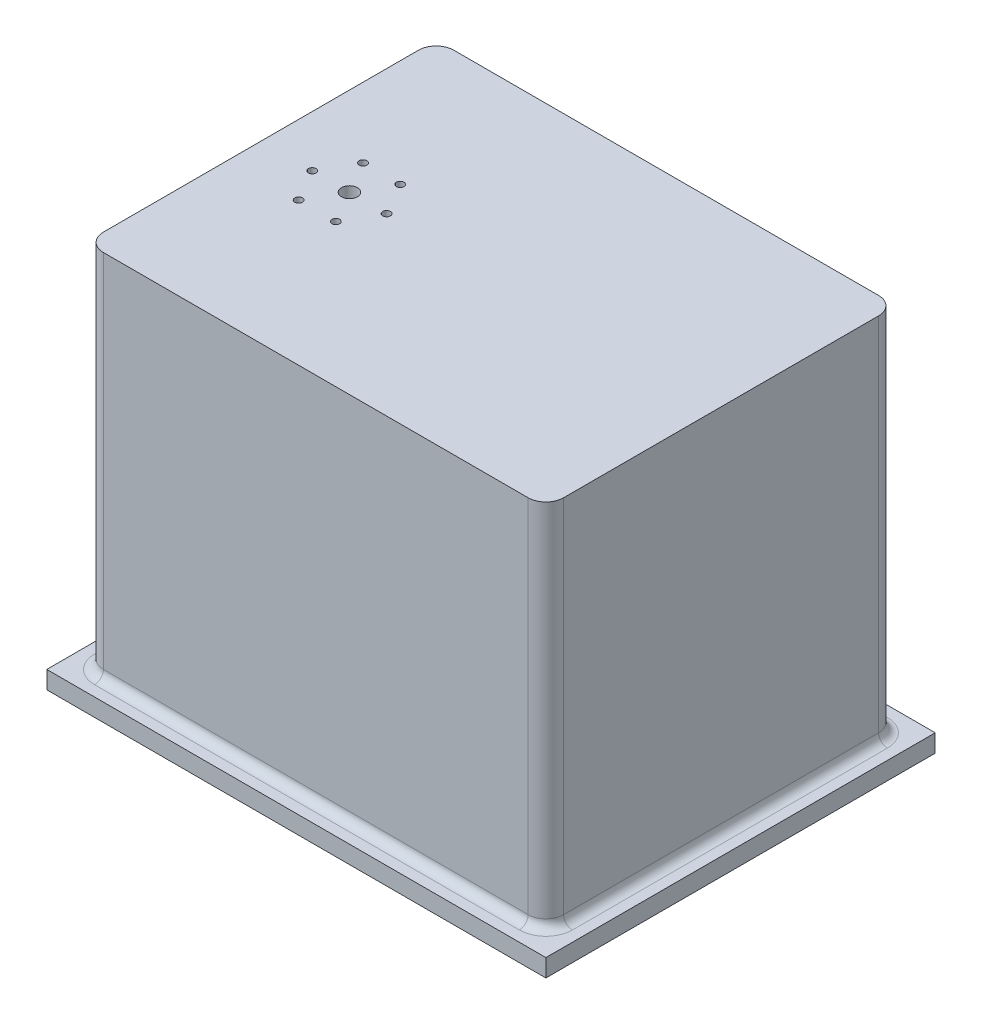
ISO-10303-21;
HEADER;
FILE_DESCRIPTION(('STEP AP214'),'2;1');
FILE_NAME('part.step','',(''),(''),'','','');
FILE_SCHEMA(('AUTOMOTIVE_DESIGN { 1 0 10303 214 1 1 1 1 }'));
ENDSEC;
DATA;
#1=APPLICATION_CONTEXT('core data for automotive mechanical design processes');
#2=APPLICATION_PROTOCOL_DEFINITION('international standard','automotive_design',2000,#1);
#3=PRODUCT_CONTEXT('',#1,'mechanical');
#4=PRODUCT('Part','Part','',(#3));
#5=PRODUCT_RELATED_PRODUCT_CATEGORY('part','',(#4));
#6=PRODUCT_DEFINITION_FORMATION('','',#4);
#7=PRODUCT_DEFINITION_CONTEXT('part definition',#1,'design');
#8=PRODUCT_DEFINITION('design','',#6,#7);
#9=PRODUCT_DEFINITION_SHAPE('','',#8);
#10=(LENGTH_UNIT() NAMED_UNIT(*) SI_UNIT(.MILLI.,.METRE.));
#11=(NAMED_UNIT(*) PLANE_ANGLE_UNIT() SI_UNIT($,.RADIAN.));
#12=(NAMED_UNIT(*) SI_UNIT($,.STERADIAN.) SOLID_ANGLE_UNIT());
#13=UNCERTAINTY_MEASURE_WITH_UNIT(LENGTH_MEASURE(1.E-05),#10,'distance_accuracy_value','');
#14=(GEOMETRIC_REPRESENTATION_CONTEXT(3) GLOBAL_UNCERTAINTY_ASSIGNED_CONTEXT((#13)) GLOBAL_UNIT_ASSIGNED_CONTEXT((#10,
#11,#12)) REPRESENTATION_CONTEXT('',''));
#15=CARTESIAN_POINT('',(0.,0.,0.));
#16=DIRECTION('',(0.,0.,1.));
#17=DIRECTION('',(1.,0.,0.));
#18=AXIS2_PLACEMENT_3D('',#15,#16,#17);
#19=CARTESIAN_POINT('',(0.,0.,0.));
#20=DIRECTION('',(0.,1.,0.));
#21=DIRECTION('',(0.,0.,1.));
#22=AXIS2_PLACEMENT_3D('',#19,#20,#21);
#23=PLANE('',#22);
#24=DIRECTION('',(-1.,0.,0.));
#25=VECTOR('',#24,1.);
#26=CARTESIAN_POINT('',(120.,0.,-89.));
#27=LINE('',#26,#25);
#28=CARTESIAN_POINT('',(120.,0.,-89.));
#29=VERTEX_POINT('',#28);
#30=CARTESIAN_POINT('',(-120.,0.,-89.));
#31=VERTEX_POINT('',#30);
#32=EDGE_CURVE('E208',#29,#31,#27,.T.);
#33=ORIENTED_EDGE('',*,*,#32,.T.);
#34=DIRECTION('',(0.,0.,1.));
#35=VECTOR('',#34,1.);
#36=CARTESIAN_POINT('',(-120.,0.,-89.));
#37=LINE('',#36,#35);
#38=CARTESIAN_POINT('',(-120.,0.,89.));
#39=VERTEX_POINT('',#38);
#40=EDGE_CURVE('E213',#31,#39,#37,.T.);
#41=ORIENTED_EDGE('',*,*,#40,.T.);
#42=DIRECTION('',(1.,0.,0.));
#43=VECTOR('',#42,1.);
#44=CARTESIAN_POINT('',(-120.,0.,89.));
#45=LINE('',#44,#43);
#46=CARTESIAN_POINT('',(120.,0.,89.));
#47=VERTEX_POINT('',#46);
#48=EDGE_CURVE('E237',#39,#47,#45,.T.);
#49=ORIENTED_EDGE('',*,*,#48,.T.);
#50=DIRECTION('',(0.,0.,-1.));
#51=VECTOR('',#50,1.);
#52=CARTESIAN_POINT('',(120.,0.,89.));
#53=LINE('',#52,#51);
#54=EDGE_CURVE('E224',#47,#29,#53,.T.);
#55=ORIENTED_EDGE('',*,*,#54,.T.);
#56=EDGE_LOOP('',(#33,#41,#49,#55));
#57=FACE_BOUND('',#56,.T.);
#58=DIRECTION('',(0.,0.,-1.));
#59=VECTOR('',#58,1.);
#60=CARTESIAN_POINT('',(141.,0.,110.));
#61=LINE('',#60,#59);
#62=CARTESIAN_POINT('',(141.,0.,110.));
#63=VERTEX_POINT('',#62);
#64=CARTESIAN_POINT('',(141.,0.,-110.));
#65=VERTEX_POINT('',#64);
#66=EDGE_CURVE('E206',#63,#65,#61,.T.);
#67=ORIENTED_EDGE('',*,*,#66,.F.);
#68=DIRECTION('',(1.,0.,0.));
#69=VECTOR('',#68,1.);
#70=CARTESIAN_POINT('',(-141.,0.,110.));
#71=LINE('',#70,#69);
#72=CARTESIAN_POINT('',(-141.,0.,110.));
#73=VERTEX_POINT('',#72);
#74=EDGE_CURVE('E202',#73,#63,#71,.T.);
#75=ORIENTED_EDGE('',*,*,#74,.F.);
#76=DIRECTION('',(0.,0.,1.));
#77=VECTOR('',#76,1.);
#78=CARTESIAN_POINT('',(-141.,0.,-110.));
#79=LINE('',#78,#77);
#80=CARTESIAN_POINT('',(-141.,0.,-110.));
#81=VERTEX_POINT('',#80);
#82=EDGE_CURVE('E396',#81,#73,#79,.T.);
#83=ORIENTED_EDGE('',*,*,#82,.F.);
#84=DIRECTION('',(-1.,0.,0.));
#85=VECTOR('',#84,1.);
#86=CARTESIAN_POINT('',(141.,0.,-110.));
#87=LINE('',#86,#85);
#88=EDGE_CURVE('E393',#65,#81,#87,.T.);
#89=ORIENTED_EDGE('',*,*,#88,.F.);
#90=EDGE_LOOP('',(#67,#75,#83,#89));
#91=FACE_BOUND('',#90,.T.);
#92=ADVANCED_FACE('F41',(#57,#91),#23,.F.);
#93=CARTESIAN_POINT('',(120.,209.,-89.));
#94=DIRECTION('',(0.,0.,1.));
#95=DIRECTION('',(1.,0.,0.));
#96=AXIS2_PLACEMENT_3D('',#93,#94,#95);
#97=PLANE('',#96);
#98=ORIENTED_EDGE('',*,*,#32,.F.);
#99=DIRECTION('',(0.,-1.,0.));
#100=VECTOR('',#99,1.);
#101=CARTESIAN_POINT('',(120.,209.,-89.));
#102=LINE('',#101,#100);
#103=CARTESIAN_POINT('',(120.,209.,-89.));
#104=VERTEX_POINT('',#103);
#105=EDGE_CURVE('E232',#104,#29,#102,.T.);
#106=ORIENTED_EDGE('',*,*,#105,.F.);
#107=DIRECTION('',(-1.,0.,0.));
#108=VECTOR('',#107,1.);
#109=CARTESIAN_POINT('',(120.,209.,-89.));
#110=LINE('',#109,#108);
#111=CARTESIAN_POINT('',(-120.,209.,-89.));
#112=VERTEX_POINT('',#111);
#113=EDGE_CURVE('E219',#104,#112,#110,.T.);
#114=ORIENTED_EDGE('',*,*,#113,.T.);
#115=DIRECTION('',(0.,-1.,0.));
#116=VECTOR('',#115,1.);
#117=CARTESIAN_POINT('',(-120.,209.,-89.));
#118=LINE('',#117,#116);
#119=EDGE_CURVE('E253',#112,#31,#118,.T.);
#120=ORIENTED_EDGE('',*,*,#119,.T.);
#121=EDGE_LOOP('',(#98,#106,#114,#120));
#122=FACE_BOUND('',#121,.T.);
#123=ADVANCED_FACE('F562',(#122),#97,.T.);
#124=CARTESIAN_POINT('',(-120.,209.,-89.));
#125=DIRECTION('',(1.,0.,0.));
#126=DIRECTION('',(0.,0.,-1.));
#127=AXIS2_PLACEMENT_3D('',#124,#125,#126);
#128=PLANE('',#127);
#129=ORIENTED_EDGE('',*,*,#40,.F.);
#130=ORIENTED_EDGE('',*,*,#119,.F.);
#131=DIRECTION('',(0.,0.,1.));
#132=VECTOR('',#131,1.);
#133=CARTESIAN_POINT('',(-120.,209.,-89.));
#134=LINE('',#133,#132);
#135=CARTESIAN_POINT('',(-120.,209.,89.));
#136=VERTEX_POINT('',#135);
#137=EDGE_CURVE('E223',#112,#136,#134,.T.);
#138=ORIENTED_EDGE('',*,*,#137,.T.);
#139=DIRECTION('',(0.,-1.,0.));
#140=VECTOR('',#139,1.);
#141=CARTESIAN_POINT('',(-120.,209.,89.));
#142=LINE('',#141,#140);
#143=EDGE_CURVE('E250',#136,#39,#142,.T.);
#144=ORIENTED_EDGE('',*,*,#143,.T.);
#145=EDGE_LOOP('',(#129,#130,#138,#144));
#146=FACE_BOUND('',#145,.T.);
#147=ADVANCED_FACE('F568',(#146),#128,.T.);
#148=CARTESIAN_POINT('',(-120.,209.,89.));
#149=DIRECTION('',(0.,0.,-1.));
#150=DIRECTION('',(-1.,0.,0.));
#151=AXIS2_PLACEMENT_3D('',#148,#149,#150);
#152=PLANE('',#151);
#153=ORIENTED_EDGE('',*,*,#48,.F.);
#154=ORIENTED_EDGE('',*,*,#143,.F.);
#155=DIRECTION('',(1.,0.,0.));
#156=VECTOR('',#155,1.);
#157=CARTESIAN_POINT('',(-120.,209.,89.));
#158=LINE('',#157,#156);
#159=CARTESIAN_POINT('',(120.,209.,89.));
#160=VERTEX_POINT('',#159);
#161=EDGE_CURVE('E227',#136,#160,#158,.T.);
#162=ORIENTED_EDGE('',*,*,#161,.T.);
#163=DIRECTION('',(0.,-1.,0.));
#164=VECTOR('',#163,1.);
#165=CARTESIAN_POINT('',(120.,209.,89.));
#166=LINE('',#165,#164);
#167=EDGE_CURVE('E247',#160,#47,#166,.T.);
#168=ORIENTED_EDGE('',*,*,#167,.T.);
#169=EDGE_LOOP('',(#153,#154,#162,#168));
#170=FACE_BOUND('',#169,.T.);
#171=ADVANCED_FACE('F622',(#170),#152,.T.);
#172=CARTESIAN_POINT('',(120.,209.,89.));
#173=DIRECTION('',(-1.,0.,0.));
#174=DIRECTION('',(0.,0.,1.));
#175=AXIS2_PLACEMENT_3D('',#172,#173,#174);
#176=PLANE('',#175);
#177=ORIENTED_EDGE('',*,*,#54,.F.);
#178=ORIENTED_EDGE('',*,*,#167,.F.);
#179=DIRECTION('',(0.,0.,-1.));
#180=VECTOR('',#179,1.);
#181=CARTESIAN_POINT('',(120.,209.,89.));
#182=LINE('',#181,#180);
#183=EDGE_CURVE('E230',#160,#104,#182,.T.);
#184=ORIENTED_EDGE('',*,*,#183,.T.);
#185=ORIENTED_EDGE('',*,*,#105,.T.);
#186=EDGE_LOOP('',(#177,#178,#184,#185));
#187=FACE_BOUND('',#186,.T.);
#188=ADVANCED_FACE('F618',(#187),#176,.T.);
#189=CARTESIAN_POINT('',(0.,209.,0.));
#190=DIRECTION('',(0.,1.,0.));
#191=DIRECTION('',(0.,0.,1.));
#192=AXIS2_PLACEMENT_3D('',#189,#190,#191);
#193=PLANE('',#192);
#194=CARTESIAN_POINT('',(-59.,209.,0.));
#195=DIRECTION('',(0.,1.,0.));
#196=DIRECTION('',(0.,0.,1.));
#197=AXIS2_PLACEMENT_3D('',#194,#195,#196);
#198=CIRCLE('',#197,2.17);
#199=CARTESIAN_POINT('',(-59.,209.,2.17));
#200=VERTEX_POINT('',#199);
#201=EDGE_CURVE('E361',#200,#200,#198,.T.);
#202=ORIENTED_EDGE('',*,*,#201,.T.);
#203=EDGE_LOOP('',(#202));
#204=FACE_BOUND('',#203,.T.);
#205=CARTESIAN_POINT('',(-80.,209.,0.));
#206=DIRECTION('',(0.,1.,0.));
#207=DIRECTION('',(0.,0.,1.));
#208=AXIS2_PLACEMENT_3D('',#205,#206,#207);
#209=CIRCLE('',#208,4.5);
#210=CARTESIAN_POINT('',(-80.,209.,4.5));
#211=VERTEX_POINT('',#210);
#212=EDGE_CURVE('E423',#211,#211,#209,.T.);
#213=ORIENTED_EDGE('',*,*,#212,.T.);
#214=EDGE_LOOP('',(#213));
#215=FACE_BOUND('',#214,.T.);
#216=CARTESIAN_POINT('',(-69.5,209.,18.1865334794732));
#217=DIRECTION('',(0.,1.,0.));
#218=DIRECTION('',(0.,0.,1.));
#219=AXIS2_PLACEMENT_3D('',#216,#217,#218);
#220=CIRCLE('',#219,2.17);
#221=CARTESIAN_POINT('',(-69.5,209.,20.3565334794732));
#222=VERTEX_POINT('',#221);
#223=EDGE_CURVE('E427',#222,#222,#220,.T.);
#224=ORIENTED_EDGE('',*,*,#223,.T.);
#225=EDGE_LOOP('',(#224));
#226=FACE_BOUND('',#225,.T.);
#227=CARTESIAN_POINT('',(-90.5000000000001,209.,18.1865334794732));
#228=DIRECTION('',(0.,1.,0.));
#229=DIRECTION('',(0.,0.,1.));
#230=AXIS2_PLACEMENT_3D('',#227,#228,#229);
#231=CIRCLE('',#230,2.17);
#232=CARTESIAN_POINT('',(-90.5000000000001,209.,20.3565334794732));
#233=VERTEX_POINT('',#232);
#234=EDGE_CURVE('E431',#233,#233,#231,.T.);
#235=ORIENTED_EDGE('',*,*,#234,.T.);
#236=EDGE_LOOP('',(#235));
#237=FACE_BOUND('',#236,.T.);
#238=CARTESIAN_POINT('',(-101.,209.,-1.51785732787831E-13));
#239=DIRECTION('',(0.,1.,0.));
#240=DIRECTION('',(0.,0.,1.));
#241=AXIS2_PLACEMENT_3D('',#238,#239,#240);
#242=CIRCLE('',#241,2.17);
#243=CARTESIAN_POINT('',(-101.,209.,2.16999999999985));
#244=VERTEX_POINT('',#243);
#245=EDGE_CURVE('E435',#244,#244,#242,.T.);
#246=ORIENTED_EDGE('',*,*,#245,.T.);
#247=EDGE_LOOP('',(#246));
#248=FACE_BOUND('',#247,.T.);
#249=CARTESIAN_POINT('',(-90.4999999999998,209.,-18.1865334794733));
#250=DIRECTION('',(0.,1.,0.));
#251=DIRECTION('',(0.,0.,1.));
#252=AXIS2_PLACEMENT_3D('',#249,#250,#251);
#253=CIRCLE('',#252,2.17);
#254=CARTESIAN_POINT('',(-90.4999999999998,209.,-16.0165334794733));
#255=VERTEX_POINT('',#254);
#256=EDGE_CURVE('E439',#255,#255,#253,.T.);
#257=ORIENTED_EDGE('',*,*,#256,.T.);
#258=EDGE_LOOP('',(#257));
#259=FACE_BOUND('',#258,.T.);
#260=CARTESIAN_POINT('',(-69.4999999999998,209.,-18.1865334794731));
#261=DIRECTION('',(0.,1.,0.));
#262=DIRECTION('',(0.,0.,1.));
#263=AXIS2_PLACEMENT_3D('',#260,#261,#262);
#264=CIRCLE('',#263,2.17);
#265=CARTESIAN_POINT('',(-69.4999999999998,209.,-16.0165334794731));
#266=VERTEX_POINT('',#265);
#267=EDGE_CURVE('E443',#266,#266,#264,.T.);
#268=ORIENTED_EDGE('',*,*,#267,.T.);
#269=EDGE_LOOP('',(#268));
#270=FACE_BOUND('',#269,.T.);
#271=ORIENTED_EDGE('',*,*,#113,.F.);
#272=ORIENTED_EDGE('',*,*,#183,.F.);
#273=ORIENTED_EDGE('',*,*,#161,.F.);
#274=ORIENTED_EDGE('',*,*,#137,.F.);
#275=EDGE_LOOP('',(#271,#272,#273,#274));
#276=FACE_BOUND('',#275,.T.);
#277=ADVANCED_FACE('F607',(#204,#215,#226,#237,#248,#259,#270,#276),#193,.F.);
#278=CARTESIAN_POINT('',(0.,9.99999999999997,0.));
#279=DIRECTION('',(0.,1.,0.));
#280=DIRECTION('',(0.,0.,1.));
#281=AXIS2_PLACEMENT_3D('',#278,#279,#280);
#282=PLANE('',#281);
#283=DIRECTION('',(1.,0.,0.));
#284=VECTOR('',#283,1.);
#285=CARTESIAN_POINT('',(0.,9.99999999999997,104.));
#286=LINE('',#285,#284);
#287=CARTESIAN_POINT('',(120.,9.99999999999997,104.));
#288=VERTEX_POINT('',#287);
#289=CARTESIAN_POINT('',(-120.,9.99999999999997,104.));
#290=VERTEX_POINT('',#289);
#291=EDGE_CURVE('E311',#288,#290,#286,.F.);
#292=ORIENTED_EDGE('',*,*,#291,.T.);
#293=CARTESIAN_POINT('',(-120.,9.99999999999997,89.));
#294=DIRECTION('',(0.,1.,0.));
#295=DIRECTION('',(0.,0.,1.));
#296=AXIS2_PLACEMENT_3D('',#293,#294,#295);
#297=CIRCLE('',#296,15.);
#298=CARTESIAN_POINT('',(-135.,9.99999999999997,89.));
#299=VERTEX_POINT('',#298);
#300=EDGE_CURVE('E332',#290,#299,#297,.F.);
#301=ORIENTED_EDGE('',*,*,#300,.T.);
#302=DIRECTION('',(0.,0.,1.));
#303=VECTOR('',#302,1.);
#304=CARTESIAN_POINT('',(-135.,9.99999999999997,0.));
#305=LINE('',#304,#303);
#306=CARTESIAN_POINT('',(-135.,9.99999999999997,-89.));
#307=VERTEX_POINT('',#306);
#308=EDGE_CURVE('E329',#299,#307,#305,.F.);
#309=ORIENTED_EDGE('',*,*,#308,.T.);
#310=CARTESIAN_POINT('',(-120.,9.99999999999997,-89.));
#311=DIRECTION('',(0.,1.,0.));
#312=DIRECTION('',(0.,0.,1.));
#313=AXIS2_PLACEMENT_3D('',#310,#311,#312);
#314=CIRCLE('',#313,15.);
#315=CARTESIAN_POINT('',(-120.,9.99999999999997,-104.));
#316=VERTEX_POINT('',#315);
#317=EDGE_CURVE('E326',#307,#316,#314,.F.);
#318=ORIENTED_EDGE('',*,*,#317,.T.);
#319=DIRECTION('',(-1.,0.,0.));
#320=VECTOR('',#319,1.);
#321=CARTESIAN_POINT('',(0.,9.99999999999997,-104.));
#322=LINE('',#321,#320);
#323=CARTESIAN_POINT('',(120.,9.99999999999997,-104.));
#324=VERTEX_POINT('',#323);
#325=EDGE_CURVE('E323',#316,#324,#322,.F.);
#326=ORIENTED_EDGE('',*,*,#325,.T.);
#327=CARTESIAN_POINT('',(120.,9.99999999999997,-89.));
#328=DIRECTION('',(0.,1.,0.));
#329=DIRECTION('',(0.,0.,1.));
#330=AXIS2_PLACEMENT_3D('',#327,#328,#329);
#331=CIRCLE('',#330,15.);
#332=CARTESIAN_POINT('',(135.,9.99999999999997,-89.));
#333=VERTEX_POINT('',#332);
#334=EDGE_CURVE('E320',#324,#333,#331,.F.);
#335=ORIENTED_EDGE('',*,*,#334,.T.);
#336=DIRECTION('',(0.,0.,-1.));
#337=VECTOR('',#336,1.);
#338=CARTESIAN_POINT('',(135.,9.99999999999997,0.));
#339=LINE('',#338,#337);
#340=CARTESIAN_POINT('',(135.,9.99999999999997,89.));
#341=VERTEX_POINT('',#340);
#342=EDGE_CURVE('E317',#333,#341,#339,.F.);
#343=ORIENTED_EDGE('',*,*,#342,.T.);
#344=CARTESIAN_POINT('',(120.,9.99999999999997,89.));
#345=DIRECTION('',(0.,1.,0.));
#346=DIRECTION('',(0.,0.,1.));
#347=AXIS2_PLACEMENT_3D('',#344,#345,#346);
#348=CIRCLE('',#347,15.);
#349=EDGE_CURVE('E314',#341,#288,#348,.F.);
#350=ORIENTED_EDGE('',*,*,#349,.T.);
#351=EDGE_LOOP('',(#292,#301,#309,#318,#326,#335,#343,#350));
#352=FACE_BOUND('',#351,.T.);
#353=DIRECTION('',(0.,0.,-1.));
#354=VECTOR('',#353,1.);
#355=CARTESIAN_POINT('',(141.,9.99999999999997,110.));
#356=LINE('',#355,#354);
#357=CARTESIAN_POINT('',(141.,9.99999999999997,110.));
#358=VERTEX_POINT('',#357);
#359=CARTESIAN_POINT('',(141.,9.99999999999997,-110.));
#360=VERTEX_POINT('',#359);
#361=EDGE_CURVE('E192',#358,#360,#356,.T.);
#362=ORIENTED_EDGE('',*,*,#361,.T.);
#363=DIRECTION('',(-1.,0.,0.));
#364=VECTOR('',#363,1.);
#365=CARTESIAN_POINT('',(141.,9.99999999999997,-110.));
#366=LINE('',#365,#364);
#367=CARTESIAN_POINT('',(-141.,9.99999999999997,-110.));
#368=VERTEX_POINT('',#367);
#369=EDGE_CURVE('E180',#360,#368,#366,.T.);
#370=ORIENTED_EDGE('',*,*,#369,.T.);
#371=DIRECTION('',(0.,0.,1.));
#372=VECTOR('',#371,1.);
#373=CARTESIAN_POINT('',(-141.,9.99999999999997,-110.));
#374=LINE('',#373,#372);
#375=CARTESIAN_POINT('',(-141.,9.99999999999997,110.));
#376=VERTEX_POINT('',#375);
#377=EDGE_CURVE('E191',#368,#376,#374,.T.);
#378=ORIENTED_EDGE('',*,*,#377,.T.);
#379=DIRECTION('',(1.,0.,0.));
#380=VECTOR('',#379,1.);
#381=CARTESIAN_POINT('',(-141.,9.99999999999997,110.));
#382=LINE('',#381,#380);
#383=EDGE_CURVE('E197',#376,#358,#382,.T.);
#384=ORIENTED_EDGE('',*,*,#383,.T.);
#385=EDGE_LOOP('',(#362,#370,#378,#384));
#386=FACE_BOUND('',#385,.T.);
#387=ADVANCED_FACE('F195',(#352,#386),#282,.T.);
#388=CARTESIAN_POINT('',(141.,9.99999999999997,110.));
#389=DIRECTION('',(-1.,0.,0.));
#390=DIRECTION('',(0.,0.,1.));
#391=AXIS2_PLACEMENT_3D('',#388,#389,#390);
#392=PLANE('',#391);
#393=ORIENTED_EDGE('',*,*,#66,.T.);
#394=DIRECTION('',(0.,-1.,0.));
#395=VECTOR('',#394,1.);
#396=CARTESIAN_POINT('',(141.,9.99999999999997,-110.));
#397=LINE('',#396,#395);
#398=EDGE_CURVE('E184',#360,#65,#397,.T.);
#399=ORIENTED_EDGE('',*,*,#398,.F.);
#400=ORIENTED_EDGE('',*,*,#361,.F.);
#401=DIRECTION('',(0.,-1.,0.));
#402=VECTOR('',#401,1.);
#403=CARTESIAN_POINT('',(141.,9.99999999999997,110.));
#404=LINE('',#403,#402);
#405=EDGE_CURVE('E405',#358,#63,#404,.T.);
#406=ORIENTED_EDGE('',*,*,#405,.T.);
#407=EDGE_LOOP('',(#393,#399,#400,#406));
#408=FACE_BOUND('',#407,.T.);
#409=ADVANCED_FACE('F204',(#408),#392,.F.);
#410=CARTESIAN_POINT('',(141.,9.99999999999997,-110.));
#411=DIRECTION('',(0.,0.,1.));
#412=DIRECTION('',(1.,0.,0.));
#413=AXIS2_PLACEMENT_3D('',#410,#411,#412);
#414=PLANE('',#413);
#415=ORIENTED_EDGE('',*,*,#88,.T.);
#416=DIRECTION('',(0.,-1.,0.));
#417=VECTOR('',#416,1.);
#418=CARTESIAN_POINT('',(-141.,9.99999999999997,-110.));
#419=LINE('',#418,#417);
#420=EDGE_CURVE('E187',#368,#81,#419,.T.);
#421=ORIENTED_EDGE('',*,*,#420,.F.);
#422=ORIENTED_EDGE('',*,*,#369,.F.);
#423=ORIENTED_EDGE('',*,*,#398,.T.);
#424=EDGE_LOOP('',(#415,#421,#422,#423));
#425=FACE_BOUND('',#424,.T.);
#426=ADVANCED_FACE('F182',(#425),#414,.F.);
#427=CARTESIAN_POINT('',(-141.,9.99999999999997,-110.));
#428=DIRECTION('',(1.,0.,0.));
#429=DIRECTION('',(0.,0.,-1.));
#430=AXIS2_PLACEMENT_3D('',#427,#428,#429);
#431=PLANE('',#430);
#432=ORIENTED_EDGE('',*,*,#82,.T.);
#433=DIRECTION('',(0.,-1.,0.));
#434=VECTOR('',#433,1.);
#435=CARTESIAN_POINT('',(-141.,9.99999999999997,110.));
#436=LINE('',#435,#434);
#437=EDGE_CURVE('E215',#376,#73,#436,.T.);
#438=ORIENTED_EDGE('',*,*,#437,.F.);
#439=ORIENTED_EDGE('',*,*,#377,.F.);
#440=ORIENTED_EDGE('',*,*,#420,.T.);
#441=EDGE_LOOP('',(#432,#438,#439,#440));
#442=FACE_BOUND('',#441,.T.);
#443=ADVANCED_FACE('F416',(#442),#431,.F.);
#444=CARTESIAN_POINT('',(-141.,9.99999999999997,110.));
#445=DIRECTION('',(0.,0.,-1.));
#446=DIRECTION('',(-1.,0.,0.));
#447=AXIS2_PLACEMENT_3D('',#444,#445,#446);
#448=PLANE('',#447);
#449=ORIENTED_EDGE('',*,*,#74,.T.);
#450=ORIENTED_EDGE('',*,*,#405,.F.);
#451=ORIENTED_EDGE('',*,*,#383,.F.);
#452=ORIENTED_EDGE('',*,*,#437,.T.);
#453=EDGE_LOOP('',(#449,#450,#451,#452));
#454=FACE_BOUND('',#453,.T.);
#455=ADVANCED_FACE('F412',(#454),#448,.F.);
#456=CARTESIAN_POINT('',(0.,219.,0.));
#457=DIRECTION('',(0.,1.,0.));
#458=DIRECTION('',(0.,0.,1.));
#459=AXIS2_PLACEMENT_3D('',#456,#457,#458);
#460=PLANE('',#459);
#461=CARTESIAN_POINT('',(-59.,219.,0.));
#462=DIRECTION('',(0.,1.,0.));
#463=DIRECTION('',(0.,0.,1.));
#464=AXIS2_PLACEMENT_3D('',#461,#462,#463);
#465=CIRCLE('',#464,2.17);
#466=CARTESIAN_POINT('',(-59.,219.,2.17));
#467=VERTEX_POINT('',#466);
#468=EDGE_CURVE('E447',#467,#467,#465,.T.);
#469=ORIENTED_EDGE('',*,*,#468,.F.);
#470=EDGE_LOOP('',(#469));
#471=FACE_BOUND('',#470,.T.);
#472=CARTESIAN_POINT('',(-80.,219.,0.));
#473=DIRECTION('',(0.,1.,0.));
#474=DIRECTION('',(0.,0.,1.));
#475=AXIS2_PLACEMENT_3D('',#472,#473,#474);
#476=CIRCLE('',#475,4.5);
#477=CARTESIAN_POINT('',(-80.,219.,4.5));
#478=VERTEX_POINT('',#477);
#479=EDGE_CURVE('E468',#478,#478,#476,.T.);
#480=ORIENTED_EDGE('',*,*,#479,.F.);
#481=EDGE_LOOP('',(#480));
#482=FACE_BOUND('',#481,.T.);
#483=CARTESIAN_POINT('',(-69.5,219.,18.1865334794732));
#484=DIRECTION('',(0.,1.,0.));
#485=DIRECTION('',(0.,0.,1.));
#486=AXIS2_PLACEMENT_3D('',#483,#484,#485);
#487=CIRCLE('',#486,2.17);
#488=CARTESIAN_POINT('',(-69.5,219.,20.3565334794732));
#489=VERTEX_POINT('',#488);
#490=EDGE_CURVE('E464',#489,#489,#487,.T.);
#491=ORIENTED_EDGE('',*,*,#490,.F.);
#492=EDGE_LOOP('',(#491));
#493=FACE_BOUND('',#492,.T.);
#494=CARTESIAN_POINT('',(-90.5000000000001,219.,18.1865334794732));
#495=DIRECTION('',(0.,1.,0.));
#496=DIRECTION('',(0.,0.,1.));
#497=AXIS2_PLACEMENT_3D('',#494,#495,#496);
#498=CIRCLE('',#497,2.17);
#499=CARTESIAN_POINT('',(-90.5000000000001,219.,20.3565334794732));
#500=VERTEX_POINT('',#499);
#501=EDGE_CURVE('E460',#500,#500,#498,.T.);
#502=ORIENTED_EDGE('',*,*,#501,.F.);
#503=EDGE_LOOP('',(#502));
#504=FACE_BOUND('',#503,.T.);
#505=CARTESIAN_POINT('',(-101.,219.,-1.51785732787831E-13));
#506=DIRECTION('',(0.,1.,0.));
#507=DIRECTION('',(0.,0.,1.));
#508=AXIS2_PLACEMENT_3D('',#505,#506,#507);
#509=CIRCLE('',#508,2.17);
#510=CARTESIAN_POINT('',(-101.,219.,2.16999999999985));
#511=VERTEX_POINT('',#510);
#512=EDGE_CURVE('E456',#511,#511,#509,.T.);
#513=ORIENTED_EDGE('',*,*,#512,.F.);
#514=EDGE_LOOP('',(#513));
#515=FACE_BOUND('',#514,.T.);
#516=CARTESIAN_POINT('',(-90.4999999999998,219.,-18.1865334794733));
#517=DIRECTION('',(0.,1.,0.));
#518=DIRECTION('',(0.,0.,1.));
#519=AXIS2_PLACEMENT_3D('',#516,#517,#518);
#520=CIRCLE('',#519,2.17);
#521=CARTESIAN_POINT('',(-90.4999999999998,219.,-16.0165334794733));
#522=VERTEX_POINT('',#521);
#523=EDGE_CURVE('E452',#522,#522,#520,.T.);
#524=ORIENTED_EDGE('',*,*,#523,.F.);
#525=EDGE_LOOP('',(#524));
#526=FACE_BOUND('',#525,.T.);
#527=CARTESIAN_POINT('',(-69.4999999999998,219.,-18.1865334794731));
#528=DIRECTION('',(0.,1.,0.));
#529=DIRECTION('',(0.,0.,1.));
#530=AXIS2_PLACEMENT_3D('',#527,#528,#529);
#531=CIRCLE('',#530,2.17);
#532=CARTESIAN_POINT('',(-69.4999999999998,219.,-16.0165334794731));
#533=VERTEX_POINT('',#532);
#534=EDGE_CURVE('E448',#533,#533,#531,.T.);
#535=ORIENTED_EDGE('',*,*,#534,.F.);
#536=EDGE_LOOP('',(#535));
#537=FACE_BOUND('',#536,.T.);
#538=DIRECTION('',(0.,0.,-1.));
#539=VECTOR('',#538,1.);
#540=CARTESIAN_POINT('',(130.,219.,-99.));
#541=LINE('',#540,#539);
#542=CARTESIAN_POINT('',(130.,219.,89.));
#543=VERTEX_POINT('',#542);
#544=CARTESIAN_POINT('',(130.,219.,-89.));
#545=VERTEX_POINT('',#544);
#546=EDGE_CURVE('E265',#543,#545,#541,.T.);
#547=ORIENTED_EDGE('',*,*,#546,.T.);
#548=CARTESIAN_POINT('',(120.,219.,-89.));
#549=DIRECTION('',(0.,1.,0.));
#550=DIRECTION('',(0.,0.,1.));
#551=AXIS2_PLACEMENT_3D('',#548,#549,#550);
#552=CIRCLE('',#551,10.);
#553=CARTESIAN_POINT('',(120.,219.,-99.));
#554=VERTEX_POINT('',#553);
#555=EDGE_CURVE('E295',#545,#554,#552,.T.);
#556=ORIENTED_EDGE('',*,*,#555,.T.);
#557=DIRECTION('',(-1.,0.,0.));
#558=VECTOR('',#557,1.);
#559=CARTESIAN_POINT('',(-130.,219.,-99.));
#560=LINE('',#559,#558);
#561=CARTESIAN_POINT('',(-120.,219.,-99.));
#562=VERTEX_POINT('',#561);
#563=EDGE_CURVE('E269',#554,#562,#560,.T.);
#564=ORIENTED_EDGE('',*,*,#563,.T.);
#565=CARTESIAN_POINT('',(-120.,219.,-89.));
#566=DIRECTION('',(0.,1.,0.));
#567=DIRECTION('',(0.,0.,1.));
#568=AXIS2_PLACEMENT_3D('',#565,#566,#567);
#569=CIRCLE('',#568,10.);
#570=CARTESIAN_POINT('',(-130.,219.,-89.));
#571=VERTEX_POINT('',#570);
#572=EDGE_CURVE('E289',#562,#571,#569,.T.);
#573=ORIENTED_EDGE('',*,*,#572,.T.);
#574=DIRECTION('',(0.,0.,1.));
#575=VECTOR('',#574,1.);
#576=CARTESIAN_POINT('',(-130.,219.,-99.));
#577=LINE('',#576,#575);
#578=CARTESIAN_POINT('',(-130.,219.,89.));
#579=VERTEX_POINT('',#578);
#580=EDGE_CURVE('E257',#571,#579,#577,.T.);
#581=ORIENTED_EDGE('',*,*,#580,.T.);
#582=CARTESIAN_POINT('',(-120.,219.,89.));
#583=DIRECTION('',(0.,1.,0.));
#584=DIRECTION('',(0.,0.,1.));
#585=AXIS2_PLACEMENT_3D('',#582,#583,#584);
#586=CIRCLE('',#585,10.);
#587=CARTESIAN_POINT('',(-120.,219.,99.));
#588=VERTEX_POINT('',#587);
#589=EDGE_CURVE('E286',#579,#588,#586,.T.);
#590=ORIENTED_EDGE('',*,*,#589,.T.);
#591=DIRECTION('',(1.,0.,0.));
#592=VECTOR('',#591,1.);
#593=CARTESIAN_POINT('',(-130.,219.,99.));
#594=LINE('',#593,#592);
#595=CARTESIAN_POINT('',(120.,219.,99.));
#596=VERTEX_POINT('',#595);
#597=EDGE_CURVE('E261',#588,#596,#594,.T.);
#598=ORIENTED_EDGE('',*,*,#597,.T.);
#599=CARTESIAN_POINT('',(120.,219.,89.));
#600=DIRECTION('',(0.,1.,0.));
#601=DIRECTION('',(0.,0.,1.));
#602=AXIS2_PLACEMENT_3D('',#599,#600,#601);
#603=CIRCLE('',#602,10.);
#604=EDGE_CURVE('E292',#596,#543,#603,.T.);
#605=ORIENTED_EDGE('',*,*,#604,.T.);
#606=EDGE_LOOP('',(#547,#556,#564,#573,#581,#590,#598,#605));
#607=FACE_BOUND('',#606,.T.);
#608=ADVANCED_FACE('F479',(#471,#482,#493,#504,#515,#526,#537,#607),#460,.T.);
#609=CARTESIAN_POINT('',(-130.,219.,-99.));
#610=DIRECTION('',(0.,0.,1.));
#611=DIRECTION('',(1.,0.,0.));
#612=AXIS2_PLACEMENT_3D('',#609,#610,#611);
#613=PLANE('',#612);
#614=DIRECTION('',(0.,-1.,0.));
#615=VECTOR('',#614,1.);
#616=CARTESIAN_POINT('',(120.,219.,-99.));
#617=LINE('',#616,#615);
#618=CARTESIAN_POINT('',(120.,15.,-99.));
#619=VERTEX_POINT('',#618);
#620=EDGE_CURVE('E276',#554,#619,#617,.T.);
#621=ORIENTED_EDGE('',*,*,#620,.T.);
#622=DIRECTION('',(-1.,0.,0.));
#623=VECTOR('',#622,1.);
#624=CARTESIAN_POINT('',(-130.,15.,-99.));
#625=LINE('',#624,#623);
#626=CARTESIAN_POINT('',(-120.,15.,-99.));
#627=VERTEX_POINT('',#626);
#628=EDGE_CURVE('E346',#619,#627,#625,.T.);
#629=ORIENTED_EDGE('',*,*,#628,.T.);
#630=DIRECTION('',(0.,-1.,0.));
#631=VECTOR('',#630,1.);
#632=CARTESIAN_POINT('',(-120.,219.,-99.));
#633=LINE('',#632,#631);
#634=EDGE_CURVE('E273',#627,#562,#633,.F.);
#635=ORIENTED_EDGE('',*,*,#634,.T.);
#636=ORIENTED_EDGE('',*,*,#563,.F.);
#637=EDGE_LOOP('',(#621,#629,#635,#636));
#638=FACE_BOUND('',#637,.T.);
#639=ADVANCED_FACE('F482',(#638),#613,.F.);
#640=CARTESIAN_POINT('',(130.,219.,-99.));
#641=DIRECTION('',(-1.,0.,0.));
#642=DIRECTION('',(0.,0.,1.));
#643=AXIS2_PLACEMENT_3D('',#640,#641,#642);
#644=PLANE('',#643);
#645=DIRECTION('',(0.,-1.,0.));
#646=VECTOR('',#645,1.);
#647=CARTESIAN_POINT('',(130.,219.,89.));
#648=LINE('',#647,#646);
#649=CARTESIAN_POINT('',(130.,15.,89.));
#650=VERTEX_POINT('',#649);
#651=EDGE_CURVE('E280',#543,#650,#648,.T.);
#652=ORIENTED_EDGE('',*,*,#651,.T.);
#653=DIRECTION('',(0.,0.,-1.));
#654=VECTOR('',#653,1.);
#655=CARTESIAN_POINT('',(130.,15.,-99.));
#656=LINE('',#655,#654);
#657=CARTESIAN_POINT('',(130.,15.,-89.));
#658=VERTEX_POINT('',#657);
#659=EDGE_CURVE('E352',#650,#658,#656,.T.);
#660=ORIENTED_EDGE('',*,*,#659,.T.);
#661=DIRECTION('',(0.,-1.,0.));
#662=VECTOR('',#661,1.);
#663=CARTESIAN_POINT('',(130.,219.,-89.));
#664=LINE('',#663,#662);
#665=EDGE_CURVE('E283',#658,#545,#664,.F.);
#666=ORIENTED_EDGE('',*,*,#665,.T.);
#667=ORIENTED_EDGE('',*,*,#546,.F.);
#668=EDGE_LOOP('',(#652,#660,#666,#667));
#669=FACE_BOUND('',#668,.T.);
#670=ADVANCED_FACE('F534',(#669),#644,.F.);
#671=CARTESIAN_POINT('',(-130.,219.,99.));
#672=DIRECTION('',(0.,0.,-1.));
#673=DIRECTION('',(-1.,0.,0.));
#674=AXIS2_PLACEMENT_3D('',#671,#672,#673);
#675=PLANE('',#674);
#676=DIRECTION('',(0.,-1.,0.));
#677=VECTOR('',#676,1.);
#678=CARTESIAN_POINT('',(-120.,219.,99.));
#679=LINE('',#678,#677);
#680=CARTESIAN_POINT('',(-120.,15.,99.));
#681=VERTEX_POINT('',#680);
#682=EDGE_CURVE('E298',#588,#681,#679,.T.);
#683=ORIENTED_EDGE('',*,*,#682,.T.);
#684=DIRECTION('',(1.,0.,0.));
#685=VECTOR('',#684,1.);
#686=CARTESIAN_POINT('',(-130.,15.,99.));
#687=LINE('',#686,#685);
#688=CARTESIAN_POINT('',(120.,15.,99.));
#689=VERTEX_POINT('',#688);
#690=EDGE_CURVE('E11',#681,#689,#687,.T.);
#691=ORIENTED_EDGE('',*,*,#690,.T.);
#692=DIRECTION('',(0.,-1.,0.));
#693=VECTOR('',#692,1.);
#694=CARTESIAN_POINT('',(120.,219.,99.));
#695=LINE('',#694,#693);
#696=EDGE_CURVE('E301',#689,#596,#695,.F.);
#697=ORIENTED_EDGE('',*,*,#696,.T.);
#698=ORIENTED_EDGE('',*,*,#597,.F.);
#699=EDGE_LOOP('',(#683,#691,#697,#698));
#700=FACE_BOUND('',#699,.T.);
#701=ADVANCED_FACE('F532',(#700),#675,.F.);
#702=CARTESIAN_POINT('',(-130.,219.,-99.));
#703=DIRECTION('',(1.,0.,0.));
#704=DIRECTION('',(0.,0.,-1.));
#705=AXIS2_PLACEMENT_3D('',#702,#703,#704);
#706=PLANE('',#705);
#707=DIRECTION('',(0.,-1.,0.));
#708=VECTOR('',#707,1.);
#709=CARTESIAN_POINT('',(-130.,219.,-89.));
#710=LINE('',#709,#708);
#711=CARTESIAN_POINT('',(-130.,15.,-89.));
#712=VERTEX_POINT('',#711);
#713=EDGE_CURVE('E307',#571,#712,#710,.T.);
#714=ORIENTED_EDGE('',*,*,#713,.T.);
#715=DIRECTION('',(0.,0.,1.));
#716=VECTOR('',#715,1.);
#717=CARTESIAN_POINT('',(-130.,15.,-99.));
#718=LINE('',#717,#716);
#719=CARTESIAN_POINT('',(-130.,15.,89.));
#720=VERTEX_POINT('',#719);
#721=EDGE_CURVE('E340',#712,#720,#718,.T.);
#722=ORIENTED_EDGE('',*,*,#721,.T.);
#723=DIRECTION('',(0.,-1.,0.));
#724=VECTOR('',#723,1.);
#725=CARTESIAN_POINT('',(-130.,219.,89.));
#726=LINE('',#725,#724);
#727=EDGE_CURVE('E304',#720,#579,#726,.F.);
#728=ORIENTED_EDGE('',*,*,#727,.T.);
#729=ORIENTED_EDGE('',*,*,#580,.F.);
#730=EDGE_LOOP('',(#714,#722,#728,#729));
#731=FACE_BOUND('',#730,.T.);
#732=ADVANCED_FACE('F524',(#731),#706,.F.);
#733=CARTESIAN_POINT('',(120.,219.,-89.));
#734=DIRECTION('',(0.,-1.,0.));
#735=DIRECTION('',(0.,0.,-1.));
#736=AXIS2_PLACEMENT_3D('',#733,#734,#735);
#737=CYLINDRICAL_SURFACE('',#736,10.);
#738=ORIENTED_EDGE('',*,*,#665,.F.);
#739=CARTESIAN_POINT('',(120.,15.,-89.));
#740=DIRECTION('',(0.,1.,0.));
#741=DIRECTION('',(0.,0.,1.));
#742=AXIS2_PLACEMENT_3D('',#739,#740,#741);
#743=CIRCLE('',#742,10.);
#744=EDGE_CURVE('E349',#658,#619,#743,.T.);
#745=ORIENTED_EDGE('',*,*,#744,.T.);
#746=ORIENTED_EDGE('',*,*,#620,.F.);
#747=ORIENTED_EDGE('',*,*,#555,.F.);
#748=EDGE_LOOP('',(#738,#745,#746,#747));
#749=FACE_BOUND('',#748,.T.);
#750=ADVANCED_FACE('F504',(#749),#737,.T.);
#751=CARTESIAN_POINT('',(120.,219.,89.));
#752=DIRECTION('',(0.,-1.,0.));
#753=DIRECTION('',(0.,0.,-1.));
#754=AXIS2_PLACEMENT_3D('',#751,#752,#753);
#755=CYLINDRICAL_SURFACE('',#754,10.);
#756=ORIENTED_EDGE('',*,*,#696,.F.);
#757=CARTESIAN_POINT('',(120.,15.,89.));
#758=DIRECTION('',(0.,1.,0.));
#759=DIRECTION('',(0.,0.,1.));
#760=AXIS2_PLACEMENT_3D('',#757,#758,#759);
#761=CIRCLE('',#760,10.);
#762=EDGE_CURVE('E51',#689,#650,#761,.T.);
#763=ORIENTED_EDGE('',*,*,#762,.T.);
#764=ORIENTED_EDGE('',*,*,#651,.F.);
#765=ORIENTED_EDGE('',*,*,#604,.F.);
#766=EDGE_LOOP('',(#756,#763,#764,#765));
#767=FACE_BOUND('',#766,.T.);
#768=ADVANCED_FACE('F533',(#767),#755,.T.);
#769=CARTESIAN_POINT('',(-120.,219.,-89.));
#770=DIRECTION('',(0.,-1.,0.));
#771=DIRECTION('',(0.,0.,-1.));
#772=AXIS2_PLACEMENT_3D('',#769,#770,#771);
#773=CYLINDRICAL_SURFACE('',#772,10.);
#774=ORIENTED_EDGE('',*,*,#634,.F.);
#775=CARTESIAN_POINT('',(-120.,15.,-89.));
#776=DIRECTION('',(0.,1.,0.));
#777=DIRECTION('',(0.,0.,1.));
#778=AXIS2_PLACEMENT_3D('',#775,#776,#777);
#779=CIRCLE('',#778,10.);
#780=EDGE_CURVE('E343',#627,#712,#779,.T.);
#781=ORIENTED_EDGE('',*,*,#780,.T.);
#782=ORIENTED_EDGE('',*,*,#713,.F.);
#783=ORIENTED_EDGE('',*,*,#572,.F.);
#784=EDGE_LOOP('',(#774,#781,#782,#783));
#785=FACE_BOUND('',#784,.T.);
#786=ADVANCED_FACE('F520',(#785),#773,.T.);
#787=CARTESIAN_POINT('',(-120.,219.,89.));
#788=DIRECTION('',(0.,-1.,0.));
#789=DIRECTION('',(0.,0.,-1.));
#790=AXIS2_PLACEMENT_3D('',#787,#788,#789);
#791=CYLINDRICAL_SURFACE('',#790,10.);
#792=ORIENTED_EDGE('',*,*,#727,.F.);
#793=CARTESIAN_POINT('',(-120.,15.,89.));
#794=DIRECTION('',(0.,1.,0.));
#795=DIRECTION('',(0.,0.,1.));
#796=AXIS2_PLACEMENT_3D('',#793,#794,#795);
#797=CIRCLE('',#796,10.);
#798=EDGE_CURVE('E336',#720,#681,#797,.T.);
#799=ORIENTED_EDGE('',*,*,#798,.T.);
#800=ORIENTED_EDGE('',*,*,#682,.F.);
#801=ORIENTED_EDGE('',*,*,#589,.F.);
#802=EDGE_LOOP('',(#792,#799,#800,#801));
#803=FACE_BOUND('',#802,.T.);
#804=ADVANCED_FACE('F530',(#803),#791,.T.);
#805=CARTESIAN_POINT('',(120.,15.,-89.));
#806=DIRECTION('',(0.,1.,0.));
#807=DIRECTION('',(0.,0.,1.));
#808=AXIS2_PLACEMENT_3D('',#805,#806,#807);
#809=TOROIDAL_SURFACE('',#808,15.,5.);
#810=CARTESIAN_POINT('',(120.,15.,-104.));
#811=DIRECTION('',(1.,0.,0.));
#812=DIRECTION('',(0.,0.,-1.));
#813=AXIS2_PLACEMENT_3D('',#810,#811,#812);
#814=CIRCLE('',#813,5.);
#815=EDGE_CURVE('E379',#619,#324,#814,.T.);
#816=ORIENTED_EDGE('',*,*,#815,.F.);
#817=ORIENTED_EDGE('',*,*,#744,.F.);
#818=CARTESIAN_POINT('',(135.,15.,-89.));
#819=DIRECTION('',(0.,0.,-1.));
#820=DIRECTION('',(-1.,0.,0.));
#821=AXIS2_PLACEMENT_3D('',#818,#819,#820);
#822=CIRCLE('',#821,5.);
#823=EDGE_CURVE('E45',#333,#658,#822,.T.);
#824=ORIENTED_EDGE('',*,*,#823,.F.);
#825=ORIENTED_EDGE('',*,*,#334,.F.);
#826=EDGE_LOOP('',(#816,#817,#824,#825));
#827=FACE_BOUND('',#826,.T.);
#828=ADVANCED_FACE('F43',(#827),#809,.F.);
#829=CARTESIAN_POINT('',(135.,15.,-99.));
#830=DIRECTION('',(0.,0.,-1.));
#831=DIRECTION('',(-1.,0.,0.));
#832=AXIS2_PLACEMENT_3D('',#829,#830,#831);
#833=CYLINDRICAL_SURFACE('',#832,5.);
#834=ORIENTED_EDGE('',*,*,#823,.T.);
#835=ORIENTED_EDGE('',*,*,#659,.F.);
#836=CARTESIAN_POINT('',(135.,15.,89.));
#837=DIRECTION('',(0.,0.,-1.));
#838=DIRECTION('',(-1.,0.,0.));
#839=AXIS2_PLACEMENT_3D('',#836,#837,#838);
#840=CIRCLE('',#839,5.);
#841=EDGE_CURVE('E376',#341,#650,#840,.T.);
#842=ORIENTED_EDGE('',*,*,#841,.F.);
#843=ORIENTED_EDGE('',*,*,#342,.F.);
#844=EDGE_LOOP('',(#834,#835,#842,#843));
#845=FACE_BOUND('',#844,.T.);
#846=ADVANCED_FACE('F536',(#845),#833,.F.);
#847=CARTESIAN_POINT('',(-130.,15.,-104.));
#848=DIRECTION('',(-1.,0.,0.));
#849=DIRECTION('',(0.,0.,1.));
#850=AXIS2_PLACEMENT_3D('',#847,#848,#849);
#851=CYLINDRICAL_SURFACE('',#850,5.);
#852=ORIENTED_EDGE('',*,*,#815,.T.);
#853=ORIENTED_EDGE('',*,*,#325,.F.);
#854=CARTESIAN_POINT('',(-120.,15.,-104.));
#855=DIRECTION('',(1.,0.,0.));
#856=DIRECTION('',(0.,0.,-1.));
#857=AXIS2_PLACEMENT_3D('',#854,#855,#856);
#858=CIRCLE('',#857,5.);
#859=EDGE_CURVE('E372',#627,#316,#858,.T.);
#860=ORIENTED_EDGE('',*,*,#859,.F.);
#861=ORIENTED_EDGE('',*,*,#628,.F.);
#862=EDGE_LOOP('',(#852,#853,#860,#861));
#863=FACE_BOUND('',#862,.T.);
#864=ADVANCED_FACE('F511',(#863),#851,.F.);
#865=CARTESIAN_POINT('',(120.,15.,89.));
#866=DIRECTION('',(0.,1.,0.));
#867=DIRECTION('',(0.,0.,1.));
#868=AXIS2_PLACEMENT_3D('',#865,#866,#867);
#869=TOROIDAL_SURFACE('',#868,15.,5.);
#870=ORIENTED_EDGE('',*,*,#841,.T.);
#871=ORIENTED_EDGE('',*,*,#762,.F.);
#872=CARTESIAN_POINT('',(120.,15.,104.));
#873=DIRECTION('',(1.,0.,0.));
#874=DIRECTION('',(0.,0.,-1.));
#875=AXIS2_PLACEMENT_3D('',#872,#873,#874);
#876=CIRCLE('',#875,5.);
#877=EDGE_CURVE('E368',#288,#689,#876,.T.);
#878=ORIENTED_EDGE('',*,*,#877,.F.);
#879=ORIENTED_EDGE('',*,*,#349,.F.);
#880=EDGE_LOOP('',(#870,#871,#878,#879));
#881=FACE_BOUND('',#880,.T.);
#882=ADVANCED_FACE('F539',(#881),#869,.F.);
#883=CARTESIAN_POINT('',(-120.,15.,-89.));
#884=DIRECTION('',(0.,1.,0.));
#885=DIRECTION('',(0.,0.,1.));
#886=AXIS2_PLACEMENT_3D('',#883,#884,#885);
#887=TOROIDAL_SURFACE('',#886,15.,5.);
#888=ORIENTED_EDGE('',*,*,#859,.T.);
#889=ORIENTED_EDGE('',*,*,#317,.F.);
#890=CARTESIAN_POINT('',(-135.,15.,-89.));
#891=DIRECTION('',(0.,0.,-1.));
#892=DIRECTION('',(-1.,0.,0.));
#893=AXIS2_PLACEMENT_3D('',#890,#891,#892);
#894=CIRCLE('',#893,5.);
#895=EDGE_CURVE('E364',#712,#307,#894,.T.);
#896=ORIENTED_EDGE('',*,*,#895,.F.);
#897=ORIENTED_EDGE('',*,*,#780,.F.);
#898=EDGE_LOOP('',(#888,#889,#896,#897));
#899=FACE_BOUND('',#898,.T.);
#900=ADVANCED_FACE('F516',(#899),#887,.F.);
#901=CARTESIAN_POINT('',(-130.,15.,104.));
#902=DIRECTION('',(1.,0.,0.));
#903=DIRECTION('',(0.,0.,-1.));
#904=AXIS2_PLACEMENT_3D('',#901,#902,#903);
#905=CYLINDRICAL_SURFACE('',#904,5.);
#906=ORIENTED_EDGE('',*,*,#877,.T.);
#907=ORIENTED_EDGE('',*,*,#690,.F.);
#908=CARTESIAN_POINT('',(-120.,15.,104.));
#909=DIRECTION('',(1.,0.,0.));
#910=DIRECTION('',(0.,0.,-1.));
#911=AXIS2_PLACEMENT_3D('',#908,#909,#910);
#912=CIRCLE('',#911,5.);
#913=EDGE_CURVE('E360',#290,#681,#912,.T.);
#914=ORIENTED_EDGE('',*,*,#913,.F.);
#915=ORIENTED_EDGE('',*,*,#291,.F.);
#916=EDGE_LOOP('',(#906,#907,#914,#915));
#917=FACE_BOUND('',#916,.T.);
#918=ADVANCED_FACE('F552',(#917),#905,.F.);
#919=CARTESIAN_POINT('',(-135.,15.,-99.));
#920=DIRECTION('',(0.,0.,1.));
#921=DIRECTION('',(1.,0.,0.));
#922=AXIS2_PLACEMENT_3D('',#919,#920,#921);
#923=CYLINDRICAL_SURFACE('',#922,5.);
#924=ORIENTED_EDGE('',*,*,#895,.T.);
#925=ORIENTED_EDGE('',*,*,#308,.F.);
#926=CARTESIAN_POINT('',(-135.,15.,89.));
#927=DIRECTION('',(0.,0.,-1.));
#928=DIRECTION('',(0.,1.,0.));
#929=AXIS2_PLACEMENT_3D('',#926,#927,#928);
#930=CIRCLE('',#929,5.);
#931=EDGE_CURVE('E357',#720,#299,#930,.T.);
#932=ORIENTED_EDGE('',*,*,#931,.F.);
#933=ORIENTED_EDGE('',*,*,#721,.F.);
#934=EDGE_LOOP('',(#924,#925,#932,#933));
#935=FACE_BOUND('',#934,.T.);
#936=ADVANCED_FACE('F546',(#935),#923,.F.);
#937=CARTESIAN_POINT('',(-120.,15.,89.));
#938=DIRECTION('',(0.,1.,0.));
#939=DIRECTION('',(0.,0.,1.));
#940=AXIS2_PLACEMENT_3D('',#937,#938,#939);
#941=TOROIDAL_SURFACE('',#940,15.,5.);
#942=ORIENTED_EDGE('',*,*,#913,.T.);
#943=ORIENTED_EDGE('',*,*,#798,.F.);
#944=ORIENTED_EDGE('',*,*,#931,.T.);
#945=ORIENTED_EDGE('',*,*,#300,.F.);
#946=EDGE_LOOP('',(#942,#943,#944,#945));
#947=FACE_BOUND('',#946,.T.);
#948=ADVANCED_FACE('F550',(#947),#941,.F.);
#949=CARTESIAN_POINT('',(-69.4999999999998,199.,-18.1865334794731));
#950=DIRECTION('',(0.,1.,0.));
#951=DIRECTION('',(0.,0.,1.));
#952=AXIS2_PLACEMENT_3D('',#949,#950,#951);
#953=CYLINDRICAL_SURFACE('',#952,2.17);
#954=ORIENTED_EDGE('',*,*,#534,.T.);
#955=EDGE_LOOP('',(#954));
#956=FACE_BOUND('',#955,.T.);
#957=ORIENTED_EDGE('',*,*,#267,.F.);
#958=EDGE_LOOP('',(#957));
#959=FACE_BOUND('',#958,.T.);
#960=ADVANCED_FACE('F589',(#956,#959),#953,.F.);
#961=CARTESIAN_POINT('',(-90.4999999999998,199.,-18.1865334794733));
#962=DIRECTION('',(0.,1.,0.));
#963=DIRECTION('',(0.,0.,1.));
#964=AXIS2_PLACEMENT_3D('',#961,#962,#963);
#965=CYLINDRICAL_SURFACE('',#964,2.17);
#966=ORIENTED_EDGE('',*,*,#523,.T.);
#967=EDGE_LOOP('',(#966));
#968=FACE_BOUND('',#967,.T.);
#969=ORIENTED_EDGE('',*,*,#256,.F.);
#970=EDGE_LOOP('',(#969));
#971=FACE_BOUND('',#970,.T.);
#972=ADVANCED_FACE('F593',(#968,#971),#965,.F.);
#973=CARTESIAN_POINT('',(-101.,199.,-1.51785732787831E-13));
#974=DIRECTION('',(0.,1.,0.));
#975=DIRECTION('',(0.,0.,1.));
#976=AXIS2_PLACEMENT_3D('',#973,#974,#975);
#977=CYLINDRICAL_SURFACE('',#976,2.17);
#978=ORIENTED_EDGE('',*,*,#512,.T.);
#979=EDGE_LOOP('',(#978));
#980=FACE_BOUND('',#979,.T.);
#981=ORIENTED_EDGE('',*,*,#245,.F.);
#982=EDGE_LOOP('',(#981));
#983=FACE_BOUND('',#982,.T.);
#984=ADVANCED_FACE('F599',(#980,#983),#977,.F.);
#985=CARTESIAN_POINT('',(-90.5000000000001,199.,18.1865334794732));
#986=DIRECTION('',(0.,1.,0.));
#987=DIRECTION('',(0.,0.,1.));
#988=AXIS2_PLACEMENT_3D('',#985,#986,#987);
#989=CYLINDRICAL_SURFACE('',#988,2.17);
#990=ORIENTED_EDGE('',*,*,#501,.T.);
#991=EDGE_LOOP('',(#990));
#992=FACE_BOUND('',#991,.T.);
#993=ORIENTED_EDGE('',*,*,#234,.F.);
#994=EDGE_LOOP('',(#993));
#995=FACE_BOUND('',#994,.T.);
#996=ADVANCED_FACE('F773',(#992,#995),#989,.F.);
#997=CARTESIAN_POINT('',(-69.5,199.,18.1865334794732));
#998=DIRECTION('',(0.,1.,0.));
#999=DIRECTION('',(0.,0.,1.));
#1000=AXIS2_PLACEMENT_3D('',#997,#998,#999);
#1001=CYLINDRICAL_SURFACE('',#1000,2.17);
#1002=ORIENTED_EDGE('',*,*,#490,.T.);
#1003=EDGE_LOOP('',(#1002));
#1004=FACE_BOUND('',#1003,.T.);
#1005=ORIENTED_EDGE('',*,*,#223,.F.);
#1006=EDGE_LOOP('',(#1005));
#1007=FACE_BOUND('',#1006,.T.);
#1008=ADVANCED_FACE('F781',(#1004,#1007),#1001,.F.);
#1009=CARTESIAN_POINT('',(-80.,199.,0.));
#1010=DIRECTION('',(0.,1.,0.));
#1011=DIRECTION('',(0.,0.,1.));
#1012=AXIS2_PLACEMENT_3D('',#1009,#1010,#1011);
#1013=CYLINDRICAL_SURFACE('',#1012,4.5);
#1014=ORIENTED_EDGE('',*,*,#479,.T.);
#1015=EDGE_LOOP('',(#1014));
#1016=FACE_BOUND('',#1015,.T.);
#1017=ORIENTED_EDGE('',*,*,#212,.F.);
#1018=EDGE_LOOP('',(#1017));
#1019=FACE_BOUND('',#1018,.T.);
#1020=ADVANCED_FACE('F790',(#1016,#1019),#1013,.F.);
#1021=CARTESIAN_POINT('',(-59.,199.,0.));
#1022=DIRECTION('',(0.,1.,0.));
#1023=DIRECTION('',(0.,0.,1.));
#1024=AXIS2_PLACEMENT_3D('',#1021,#1022,#1023);
#1025=CYLINDRICAL_SURFACE('',#1024,2.17);
#1026=ORIENTED_EDGE('',*,*,#468,.T.);
#1027=EDGE_LOOP('',(#1026));
#1028=FACE_BOUND('',#1027,.T.);
#1029=ORIENTED_EDGE('',*,*,#201,.F.);
#1030=EDGE_LOOP('',(#1029));
#1031=FACE_BOUND('',#1030,.T.);
#1032=ADVANCED_FACE('F476',(#1028,#1031),#1025,.F.);
#1033=CLOSED_SHELL('',(#92,#123,#147,#171,#188,#277,#387,#409,#426,#443,#455,#608,#639,#670,
#701,#732,#750,#768,#786,#804,#828,#846,#864,#882,#900,#918,#936,#948,#960,#972,#984,#996,#1008,
#1020,#1032));
#1034=MANIFOLD_SOLID_BREP('B2',#1033);
#1035=ADVANCED_BREP_SHAPE_REPRESENTATION('',(#18,#1034),#14);
#1036=SHAPE_DEFINITION_REPRESENTATION(#9,#1035);
ENDSEC;
END-ISO-10303-21;
